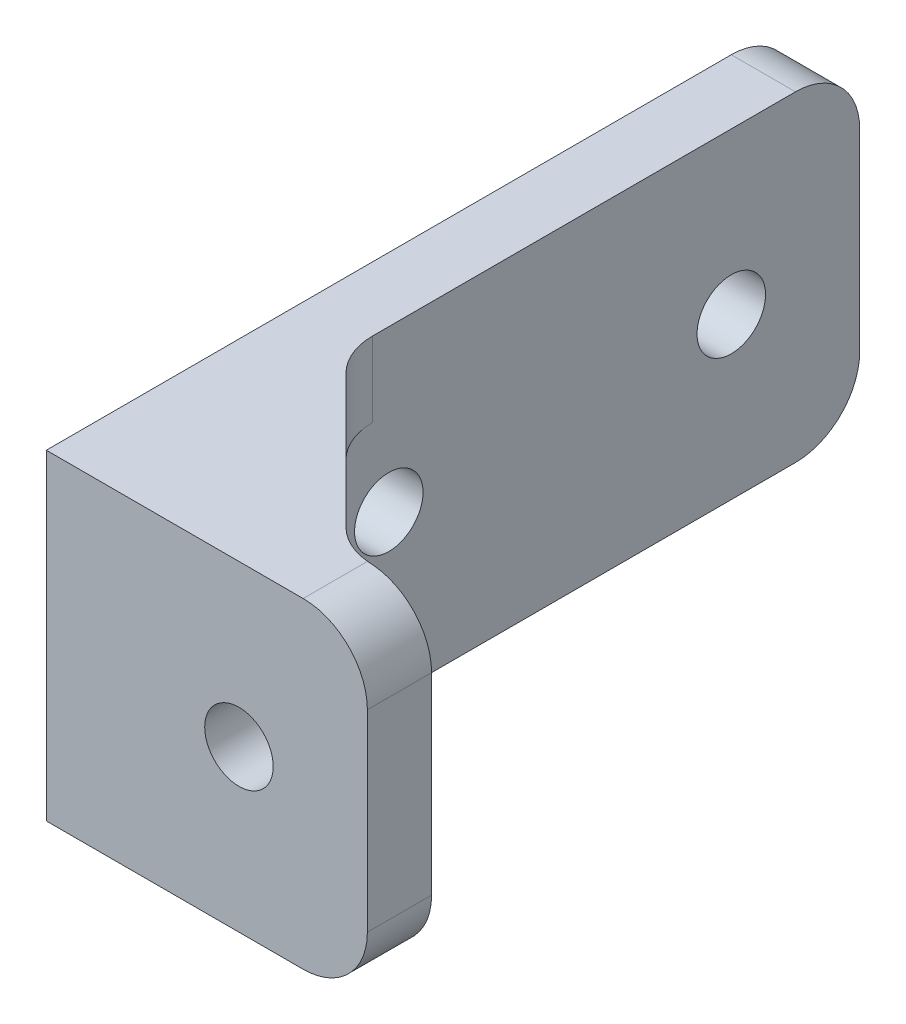
ISO-10303-21;
HEADER;
FILE_DESCRIPTION(('STEP AP214'),'2;1');
FILE_NAME('part.step','',(''),(''),'','','');
FILE_SCHEMA(('AUTOMOTIVE_DESIGN { 1 0 10303 214 1 1 1 1 }'));
ENDSEC;
DATA;
#1=APPLICATION_CONTEXT('core data for automotive mechanical design processes');
#2=APPLICATION_PROTOCOL_DEFINITION('international standard','automotive_design',2000,#1);
#3=PRODUCT_CONTEXT('',#1,'mechanical');
#4=PRODUCT('Part','Part','',(#3));
#5=PRODUCT_RELATED_PRODUCT_CATEGORY('part','',(#4));
#6=PRODUCT_DEFINITION_FORMATION('','',#4);
#7=PRODUCT_DEFINITION_CONTEXT('part definition',#1,'design');
#8=PRODUCT_DEFINITION('design','',#6,#7);
#9=PRODUCT_DEFINITION_SHAPE('','',#8);
#10=(LENGTH_UNIT() NAMED_UNIT(*) SI_UNIT(.MILLI.,.METRE.));
#11=(NAMED_UNIT(*) PLANE_ANGLE_UNIT() SI_UNIT($,.RADIAN.));
#12=(NAMED_UNIT(*) SI_UNIT($,.STERADIAN.) SOLID_ANGLE_UNIT());
#13=UNCERTAINTY_MEASURE_WITH_UNIT(LENGTH_MEASURE(1.E-05),#10,'distance_accuracy_value','');
#14=(GEOMETRIC_REPRESENTATION_CONTEXT(3) GLOBAL_UNCERTAINTY_ASSIGNED_CONTEXT((#13)) GLOBAL_UNIT_ASSIGNED_CONTEXT((#10,
#11,#12)) REPRESENTATION_CONTEXT('',''));
#15=CARTESIAN_POINT('',(0.,0.,0.));
#16=DIRECTION('',(0.,0.,1.));
#17=DIRECTION('',(1.,0.,0.));
#18=AXIS2_PLACEMENT_3D('',#15,#16,#17);
#19=CARTESIAN_POINT('',(3.,15.,-11.));
#20=DIRECTION('',(-0.707106781186551,0.,0.707106781186544));
#21=DIRECTION('',(0.,-1.,0.));
#22=AXIS2_PLACEMENT_3D('',#19,#20,#21);
#23=PLANE('',#22);
#24=DIRECTION('',(0.707106781186544,0.,0.707106781186551));
#25=VECTOR('',#24,1.);
#26=CARTESIAN_POINT('',(3.,3.5,-11.));
#27=LINE('',#26,#25);
#28=CARTESIAN_POINT('',(3.87867965644035,3.5,-10.1213203435597));
#29=VERTEX_POINT('',#28);
#30=CARTESIAN_POINT('',(10.1213203435596,3.5,-3.87867965644037));
#31=VERTEX_POINT('',#30);
#32=EDGE_CURVE('E297',#29,#31,#27,.T.);
#33=ORIENTED_EDGE('',*,*,#32,.T.);
#34=DIRECTION('',(0.,1.,0.));
#35=VECTOR('',#34,1.);
#36=CARTESIAN_POINT('',(10.1213203435596,15.,-3.87867965644037));
#37=LINE('',#36,#35);
#38=CARTESIAN_POINT('',(10.1213203435596,0.,-3.87867965644037));
#39=VERTEX_POINT('',#38);
#40=EDGE_CURVE('E333',#31,#39,#37,.F.);
#41=ORIENTED_EDGE('',*,*,#40,.T.);
#42=DIRECTION('',(0.707106781186544,0.,0.707106781186551));
#43=VECTOR('',#42,1.);
#44=CARTESIAN_POINT('',(7.00000000000004,0.,-6.99999999999997));
#45=LINE('',#44,#43);
#46=CARTESIAN_POINT('',(3.87867965644035,0.,-10.1213203435597));
#47=VERTEX_POINT('',#46);
#48=EDGE_CURVE('E285',#47,#39,#45,.T.);
#49=ORIENTED_EDGE('',*,*,#48,.F.);
#50=DIRECTION('',(0.,-1.,0.));
#51=VECTOR('',#50,1.);
#52=CARTESIAN_POINT('',(3.87867965644035,3.5,-10.1213203435597));
#53=LINE('',#52,#51);
#54=EDGE_CURVE('E330',#47,#29,#53,.F.);
#55=ORIENTED_EDGE('',*,*,#54,.T.);
#56=EDGE_LOOP('',(#33,#41,#49,#55));
#57=FACE_BOUND('',#56,.T.);
#58=ADVANCED_FACE('F47',(#57),#23,.F.);
#59=CARTESIAN_POINT('',(0.,15.,0.));
#60=DIRECTION('',(-1.,0.,0.));
#61=DIRECTION('',(0.,0.,1.));
#62=AXIS2_PLACEMENT_3D('',#59,#60,#61);
#63=PLANE('',#62);
#64=CARTESIAN_POINT('',(0.,7.5,-13.));
#65=DIRECTION('',(1.,0.,0.));
#66=DIRECTION('',(0.,0.,-1.));
#67=AXIS2_PLACEMENT_3D('',#64,#65,#66);
#68=CIRCLE('',#67,1.6);
#69=CARTESIAN_POINT('',(0.,7.5,-14.6));
#70=VERTEX_POINT('',#69);
#71=EDGE_CURVE('E493',#70,#70,#68,.T.);
#72=ORIENTED_EDGE('',*,*,#71,.T.);
#73=EDGE_LOOP('',(#72));
#74=FACE_BOUND('',#73,.T.);
#75=CARTESIAN_POINT('',(0.,7.5,-29.));
#76=DIRECTION('',(1.,0.,0.));
#77=DIRECTION('',(0.,0.,-1.));
#78=AXIS2_PLACEMENT_3D('',#75,#76,#77);
#79=CIRCLE('',#78,1.6);
#80=CARTESIAN_POINT('',(0.,7.5,-30.6));
#81=VERTEX_POINT('',#80);
#82=EDGE_CURVE('E492',#81,#81,#79,.T.);
#83=ORIENTED_EDGE('',*,*,#82,.T.);
#84=EDGE_LOOP('',(#83));
#85=FACE_BOUND('',#84,.T.);
#86=DIRECTION('',(0.,0.,-1.));
#87=VECTOR('',#86,1.);
#88=CARTESIAN_POINT('',(0.,15.,0.));
#89=LINE('',#88,#87);
#90=CARTESIAN_POINT('',(0.,15.,0.));
#91=VERTEX_POINT('',#90);
#92=CARTESIAN_POINT('',(0.,15.,-32.));
#93=VERTEX_POINT('',#92);
#94=EDGE_CURVE('E185',#91,#93,#89,.T.);
#95=ORIENTED_EDGE('',*,*,#94,.T.);
#96=CARTESIAN_POINT('',(0.,12.,-32.));
#97=DIRECTION('',(-1.,0.,0.));
#98=DIRECTION('',(0.,0.,1.));
#99=AXIS2_PLACEMENT_3D('',#96,#97,#98);
#100=CIRCLE('',#99,3.);
#101=CARTESIAN_POINT('',(0.,12.,-35.));
#102=VERTEX_POINT('',#101);
#103=EDGE_CURVE('E257',#93,#102,#100,.T.);
#104=ORIENTED_EDGE('',*,*,#103,.T.);
#105=DIRECTION('',(0.,-1.,0.));
#106=VECTOR('',#105,1.);
#107=CARTESIAN_POINT('',(0.,15.,-35.));
#108=LINE('',#107,#106);
#109=CARTESIAN_POINT('',(0.,3.,-35.));
#110=VERTEX_POINT('',#109);
#111=EDGE_CURVE('E219',#102,#110,#108,.T.);
#112=ORIENTED_EDGE('',*,*,#111,.T.);
#113=CARTESIAN_POINT('',(0.,3.,-32.));
#114=DIRECTION('',(-1.,0.,0.));
#115=DIRECTION('',(0.,0.,1.));
#116=AXIS2_PLACEMENT_3D('',#113,#114,#115);
#117=CIRCLE('',#116,3.);
#118=CARTESIAN_POINT('',(0.,0.,-32.));
#119=VERTEX_POINT('',#118);
#120=EDGE_CURVE('E254',#110,#119,#117,.T.);
#121=ORIENTED_EDGE('',*,*,#120,.T.);
#122=DIRECTION('',(0.,0.,-1.));
#123=VECTOR('',#122,1.);
#124=CARTESIAN_POINT('',(0.,0.,0.));
#125=LINE('',#124,#123);
#126=CARTESIAN_POINT('',(0.,0.,0.));
#127=VERTEX_POINT('',#126);
#128=EDGE_CURVE('E188',#127,#119,#125,.T.);
#129=ORIENTED_EDGE('',*,*,#128,.F.);
#130=DIRECTION('',(0.,-1.,0.));
#131=VECTOR('',#130,1.);
#132=CARTESIAN_POINT('',(0.,15.,0.));
#133=LINE('',#132,#131);
#134=EDGE_CURVE('E181',#91,#127,#133,.T.);
#135=ORIENTED_EDGE('',*,*,#134,.F.);
#136=EDGE_LOOP('',(#95,#104,#112,#121,#129,#135));
#137=FACE_BOUND('',#136,.T.);
#138=ADVANCED_FACE('F183',(#74,#85,#137),#63,.T.);
#139=CARTESIAN_POINT('',(0.,15.,0.));
#140=DIRECTION('',(0.,0.,-1.));
#141=DIRECTION('',(-1.,0.,0.));
#142=AXIS2_PLACEMENT_3D('',#139,#140,#141);
#143=PLANE('',#142);
#144=CARTESIAN_POINT('',(9.,7.5,0.));
#145=DIRECTION('',(0.,0.,-1.));
#146=DIRECTION('',(-1.,0.,0.));
#147=AXIS2_PLACEMENT_3D('',#144,#145,#146);
#148=CIRCLE('',#147,1.6);
#149=CARTESIAN_POINT('',(7.4,7.5,0.));
#150=VERTEX_POINT('',#149);
#151=EDGE_CURVE('E214',#150,#150,#148,.T.);
#152=ORIENTED_EDGE('',*,*,#151,.T.);
#153=EDGE_LOOP('',(#152));
#154=FACE_BOUND('',#153,.T.);
#155=DIRECTION('',(0.,-1.,0.));
#156=VECTOR('',#155,1.);
#157=CARTESIAN_POINT('',(15.,15.,0.));
#158=LINE('',#157,#156);
#159=CARTESIAN_POINT('',(15.,12.,0.));
#160=VERTEX_POINT('',#159);
#161=CARTESIAN_POINT('',(15.,3.,0.));
#162=VERTEX_POINT('',#161);
#163=EDGE_CURVE('E194',#160,#162,#158,.T.);
#164=ORIENTED_EDGE('',*,*,#163,.F.);
#165=CARTESIAN_POINT('',(12.,12.,0.));
#166=DIRECTION('',(0.,0.,-1.));
#167=DIRECTION('',(-1.,0.,0.));
#168=AXIS2_PLACEMENT_3D('',#165,#166,#167);
#169=CIRCLE('',#168,3.);
#170=CARTESIAN_POINT('',(12.,15.,0.));
#171=VERTEX_POINT('',#170);
#172=EDGE_CURVE('E200',#160,#171,#169,.F.);
#173=ORIENTED_EDGE('',*,*,#172,.T.);
#174=DIRECTION('',(1.,0.,0.));
#175=VECTOR('',#174,1.);
#176=CARTESIAN_POINT('',(0.,15.,0.));
#177=LINE('',#176,#175);
#178=EDGE_CURVE('E196',#91,#171,#177,.T.);
#179=ORIENTED_EDGE('',*,*,#178,.F.);
#180=ORIENTED_EDGE('',*,*,#134,.T.);
#181=DIRECTION('',(1.,0.,0.));
#182=VECTOR('',#181,1.);
#183=CARTESIAN_POINT('',(0.,0.,0.));
#184=LINE('',#183,#182);
#185=CARTESIAN_POINT('',(12.,0.,0.));
#186=VERTEX_POINT('',#185);
#187=EDGE_CURVE('E211',#127,#186,#184,.T.);
#188=ORIENTED_EDGE('',*,*,#187,.T.);
#189=CARTESIAN_POINT('',(12.,3.,0.));
#190=DIRECTION('',(0.,0.,-1.));
#191=DIRECTION('',(-1.,0.,0.));
#192=AXIS2_PLACEMENT_3D('',#189,#190,#191);
#193=CIRCLE('',#192,3.);
#194=EDGE_CURVE('E280',#186,#162,#193,.F.);
#195=ORIENTED_EDGE('',*,*,#194,.T.);
#196=EDGE_LOOP('',(#164,#173,#179,#180,#188,#195));
#197=FACE_BOUND('',#196,.T.);
#198=ADVANCED_FACE('F198',(#154,#197),#143,.F.);
#199=CARTESIAN_POINT('',(15.,15.,0.));
#200=DIRECTION('',(-1.,0.,0.));
#201=DIRECTION('',(0.,0.,1.));
#202=AXIS2_PLACEMENT_3D('',#199,#200,#201);
#203=PLANE('',#202);
#204=DIRECTION('',(0.,-1.,0.));
#205=VECTOR('',#204,1.);
#206=CARTESIAN_POINT('',(15.,15.,-3.));
#207=LINE('',#206,#205);
#208=CARTESIAN_POINT('',(15.,12.,-3.));
#209=VERTEX_POINT('',#208);
#210=CARTESIAN_POINT('',(15.,3.,-3.));
#211=VERTEX_POINT('',#210);
#212=EDGE_CURVE('E231',#209,#211,#207,.T.);
#213=ORIENTED_EDGE('',*,*,#212,.F.);
#214=DIRECTION('',(0.,0.,-1.));
#215=VECTOR('',#214,1.);
#216=CARTESIAN_POINT('',(15.,12.,0.));
#217=LINE('',#216,#215);
#218=EDGE_CURVE('E277',#209,#160,#217,.F.);
#219=ORIENTED_EDGE('',*,*,#218,.T.);
#220=ORIENTED_EDGE('',*,*,#163,.T.);
#221=DIRECTION('',(0.,0.,-1.));
#222=VECTOR('',#221,1.);
#223=CARTESIAN_POINT('',(15.,3.,0.));
#224=LINE('',#223,#222);
#225=EDGE_CURVE('E273',#162,#211,#224,.T.);
#226=ORIENTED_EDGE('',*,*,#225,.T.);
#227=EDGE_LOOP('',(#213,#219,#220,#226));
#228=FACE_BOUND('',#227,.T.);
#229=ADVANCED_FACE('F468',(#228),#203,.F.);
#230=CARTESIAN_POINT('',(0.,15.,-3.));
#231=DIRECTION('',(0.,0.,-1.));
#232=DIRECTION('',(-1.,0.,0.));
#233=AXIS2_PLACEMENT_3D('',#230,#231,#232);
#234=PLANE('',#233);
#235=DIRECTION('',(1.,0.,0.));
#236=VECTOR('',#235,1.);
#237=CARTESIAN_POINT('',(-8.31370849898479,3.5,-3.));
#238=LINE('',#237,#236);
#239=CARTESIAN_POINT('',(6.,3.5,-3.));
#240=VERTEX_POINT('',#239);
#241=CARTESIAN_POINT('',(12.2426406871193,3.5,-3.));
#242=VERTEX_POINT('',#241);
#243=EDGE_CURVE('E478',#240,#242,#238,.T.);
#244=ORIENTED_EDGE('',*,*,#243,.F.);
#245=DIRECTION('',(0.,-1.,0.));
#246=VECTOR('',#245,1.);
#247=CARTESIAN_POINT('',(6.,15.,-3.));
#248=LINE('',#247,#246);
#249=CARTESIAN_POINT('',(6.,11.5,-3.));
#250=VERTEX_POINT('',#249);
#251=EDGE_CURVE('E324',#240,#250,#248,.F.);
#252=ORIENTED_EDGE('',*,*,#251,.T.);
#253=DIRECTION('',(1.,0.,0.));
#254=VECTOR('',#253,1.);
#255=CARTESIAN_POINT('',(-8.31370849898479,11.5,-3.));
#256=LINE('',#255,#254);
#257=CARTESIAN_POINT('',(12.2426406871193,11.5,-3.));
#258=VERTEX_POINT('',#257);
#259=EDGE_CURVE('E442',#250,#258,#256,.T.);
#260=ORIENTED_EDGE('',*,*,#259,.T.);
#261=DIRECTION('',(0.,1.,0.));
#262=VECTOR('',#261,1.);
#263=CARTESIAN_POINT('',(12.2426406871193,15.,-3.));
#264=LINE('',#263,#262);
#265=CARTESIAN_POINT('',(12.2426406871193,14.9901714828675,-3.));
#266=VERTEX_POINT('',#265);
#267=EDGE_CURVE('E316',#258,#266,#264,.T.);
#268=ORIENTED_EDGE('',*,*,#267,.T.);
#269=CARTESIAN_POINT('',(12.,12.,-3.));
#270=DIRECTION('',(0.,0.,-1.));
#271=DIRECTION('',(-1.,0.,0.));
#272=AXIS2_PLACEMENT_3D('',#269,#270,#271);
#273=CIRCLE('',#272,3.);
#274=EDGE_CURVE('E270',#266,#209,#273,.T.);
#275=ORIENTED_EDGE('',*,*,#274,.T.);
#276=ORIENTED_EDGE('',*,*,#212,.T.);
#277=CARTESIAN_POINT('',(12.,3.,-3.));
#278=DIRECTION('',(0.,0.,-1.));
#279=DIRECTION('',(-1.,0.,0.));
#280=AXIS2_PLACEMENT_3D('',#277,#278,#279);
#281=CIRCLE('',#280,3.);
#282=CARTESIAN_POINT('',(12.2426406871193,0.00982851713245353,-3.));
#283=VERTEX_POINT('',#282);
#284=EDGE_CURVE('E266',#211,#283,#281,.T.);
#285=ORIENTED_EDGE('',*,*,#284,.T.);
#286=DIRECTION('',(0.,1.,0.));
#287=VECTOR('',#286,1.);
#288=CARTESIAN_POINT('',(12.2426406871193,15.,-3.));
#289=LINE('',#288,#287);
#290=EDGE_CURVE('E320',#283,#242,#289,.T.);
#291=ORIENTED_EDGE('',*,*,#290,.T.);
#292=EDGE_LOOP('',(#244,#252,#260,#268,#275,#276,#285,#291));
#293=FACE_BOUND('',#292,.T.);
#294=CARTESIAN_POINT('',(9.,7.5,-3.));
#295=DIRECTION('',(0.,0.,1.));
#296=DIRECTION('',(0.,-1.,0.));
#297=AXIS2_PLACEMENT_3D('',#294,#295,#296);
#298=CIRCLE('',#297,1.6);
#299=CARTESIAN_POINT('',(9.,5.9,-3.));
#300=VERTEX_POINT('',#299);
#301=EDGE_CURVE('E483',#300,#300,#298,.F.);
#302=ORIENTED_EDGE('',*,*,#301,.F.);
#303=EDGE_LOOP('',(#302));
#304=FACE_BOUND('',#303,.T.);
#305=ADVANCED_FACE('F474',(#293,#304),#234,.T.);
#306=CARTESIAN_POINT('',(3.,15.,0.));
#307=DIRECTION('',(-1.,0.,0.));
#308=DIRECTION('',(0.,0.,1.));
#309=AXIS2_PLACEMENT_3D('',#306,#307,#308);
#310=PLANE('',#309);
#311=CARTESIAN_POINT('',(3.,7.5,-13.));
#312=DIRECTION('',(1.,0.,0.));
#313=DIRECTION('',(0.,0.,-1.));
#314=AXIS2_PLACEMENT_3D('',#311,#312,#313);
#315=CIRCLE('',#314,1.6);
#316=CARTESIAN_POINT('',(3.,7.5,-14.6));
#317=VERTEX_POINT('',#316);
#318=EDGE_CURVE('E497',#317,#317,#315,.T.);
#319=ORIENTED_EDGE('',*,*,#318,.F.);
#320=EDGE_LOOP('',(#319));
#321=FACE_BOUND('',#320,.T.);
#322=CARTESIAN_POINT('',(3.,7.5,-29.));
#323=DIRECTION('',(1.,0.,0.));
#324=DIRECTION('',(0.,0.,-1.));
#325=AXIS2_PLACEMENT_3D('',#322,#323,#324);
#326=CIRCLE('',#325,1.6);
#327=CARTESIAN_POINT('',(3.,7.5,-30.6));
#328=VERTEX_POINT('',#327);
#329=EDGE_CURVE('E501',#328,#328,#326,.T.);
#330=ORIENTED_EDGE('',*,*,#329,.F.);
#331=EDGE_LOOP('',(#330));
#332=FACE_BOUND('',#331,.T.);
#333=DIRECTION('',(0.,0.,1.));
#334=VECTOR('',#333,1.);
#335=CARTESIAN_POINT('',(3.,11.5,-3.));
#336=LINE('',#335,#334);
#337=CARTESIAN_POINT('',(3.,11.5,-12.2426406871193));
#338=VERTEX_POINT('',#337);
#339=CARTESIAN_POINT('',(3.,11.5,-6.));
#340=VERTEX_POINT('',#339);
#341=EDGE_CURVE('E479',#338,#340,#336,.T.);
#342=ORIENTED_EDGE('',*,*,#341,.T.);
#343=DIRECTION('',(0.,-1.,0.));
#344=VECTOR('',#343,1.);
#345=CARTESIAN_POINT('',(3.,15.,-6.));
#346=LINE('',#345,#344);
#347=CARTESIAN_POINT('',(3.,3.5,-6.));
#348=VERTEX_POINT('',#347);
#349=EDGE_CURVE('E309',#340,#348,#346,.T.);
#350=ORIENTED_EDGE('',*,*,#349,.T.);
#351=DIRECTION('',(0.,0.,-1.));
#352=VECTOR('',#351,1.);
#353=CARTESIAN_POINT('',(3.,3.5,-3.));
#354=LINE('',#353,#352);
#355=CARTESIAN_POINT('',(3.,3.5,-12.2426406871193));
#356=VERTEX_POINT('',#355);
#357=EDGE_CURVE('E485',#348,#356,#354,.T.);
#358=ORIENTED_EDGE('',*,*,#357,.T.);
#359=DIRECTION('',(0.,-1.,0.));
#360=VECTOR('',#359,1.);
#361=CARTESIAN_POINT('',(3.,0.,-12.2426406871193));
#362=LINE('',#361,#360);
#363=CARTESIAN_POINT('',(3.,0.,-12.2426406871193));
#364=VERTEX_POINT('',#363);
#365=EDGE_CURVE('E305',#356,#364,#362,.T.);
#366=ORIENTED_EDGE('',*,*,#365,.T.);
#367=DIRECTION('',(0.,0.,-1.));
#368=VECTOR('',#367,1.);
#369=CARTESIAN_POINT('',(3.,0.,0.));
#370=LINE('',#369,#368);
#371=CARTESIAN_POINT('',(3.,0.,-32.));
#372=VERTEX_POINT('',#371);
#373=EDGE_CURVE('E208',#364,#372,#370,.T.);
#374=ORIENTED_EDGE('',*,*,#373,.T.);
#375=CARTESIAN_POINT('',(3.,3.,-32.));
#376=DIRECTION('',(-1.,0.,0.));
#377=DIRECTION('',(0.,0.,1.));
#378=AXIS2_PLACEMENT_3D('',#375,#376,#377);
#379=CIRCLE('',#378,3.);
#380=CARTESIAN_POINT('',(3.,3.,-35.));
#381=VERTEX_POINT('',#380);
#382=EDGE_CURVE('E243',#372,#381,#379,.F.);
#383=ORIENTED_EDGE('',*,*,#382,.T.);
#384=DIRECTION('',(0.,-1.,0.));
#385=VECTOR('',#384,1.);
#386=CARTESIAN_POINT('',(3.,15.,-35.));
#387=LINE('',#386,#385);
#388=CARTESIAN_POINT('',(3.,12.,-35.));
#389=VERTEX_POINT('',#388);
#390=EDGE_CURVE('E227',#389,#381,#387,.T.);
#391=ORIENTED_EDGE('',*,*,#390,.F.);
#392=CARTESIAN_POINT('',(3.,12.,-32.));
#393=DIRECTION('',(-1.,0.,0.));
#394=DIRECTION('',(0.,0.,1.));
#395=AXIS2_PLACEMENT_3D('',#392,#393,#394);
#396=CIRCLE('',#395,3.);
#397=CARTESIAN_POINT('',(3.,15.,-32.));
#398=VERTEX_POINT('',#397);
#399=EDGE_CURVE('E246',#389,#398,#396,.F.);
#400=ORIENTED_EDGE('',*,*,#399,.T.);
#401=DIRECTION('',(0.,0.,-1.));
#402=VECTOR('',#401,1.);
#403=CARTESIAN_POINT('',(3.,15.,0.));
#404=LINE('',#403,#402);
#405=CARTESIAN_POINT('',(3.,15.,-12.2426406871193));
#406=VERTEX_POINT('',#405);
#407=EDGE_CURVE('E202',#406,#398,#404,.T.);
#408=ORIENTED_EDGE('',*,*,#407,.F.);
#409=DIRECTION('',(0.,-1.,0.));
#410=VECTOR('',#409,1.);
#411=CARTESIAN_POINT('',(3.,11.5,-12.2426406871193));
#412=LINE('',#411,#410);
#413=EDGE_CURVE('E301',#406,#338,#412,.T.);
#414=ORIENTED_EDGE('',*,*,#413,.T.);
#415=EDGE_LOOP('',(#342,#350,#358,#366,#374,#383,#391,#400,#408,#414));
#416=FACE_BOUND('',#415,.T.);
#417=ADVANCED_FACE('F450',(#321,#332,#416),#310,.F.);
#418=CARTESIAN_POINT('',(0.,15.,-35.));
#419=DIRECTION('',(0.,0.,-1.));
#420=DIRECTION('',(-1.,0.,0.));
#421=AXIS2_PLACEMENT_3D('',#418,#419,#420);
#422=PLANE('',#421);
#423=ORIENTED_EDGE('',*,*,#111,.F.);
#424=DIRECTION('',(1.,0.,0.));
#425=VECTOR('',#424,1.);
#426=CARTESIAN_POINT('',(0.,12.,-35.));
#427=LINE('',#426,#425);
#428=EDGE_CURVE('E239',#102,#389,#427,.T.);
#429=ORIENTED_EDGE('',*,*,#428,.T.);
#430=ORIENTED_EDGE('',*,*,#390,.T.);
#431=DIRECTION('',(1.,0.,0.));
#432=VECTOR('',#431,1.);
#433=CARTESIAN_POINT('',(0.,3.,-35.));
#434=LINE('',#433,#432);
#435=EDGE_CURVE('E193',#381,#110,#434,.F.);
#436=ORIENTED_EDGE('',*,*,#435,.T.);
#437=EDGE_LOOP('',(#423,#429,#430,#436));
#438=FACE_BOUND('',#437,.T.);
#439=ADVANCED_FACE('F458',(#438),#422,.T.);
#440=CARTESIAN_POINT('',(0.,15.,0.));
#441=DIRECTION('',(0.,1.,0.));
#442=DIRECTION('',(0.,0.,1.));
#443=AXIS2_PLACEMENT_3D('',#440,#441,#442);
#444=PLANE('',#443);
#445=DIRECTION('',(0.,0.,-1.));
#446=VECTOR('',#445,1.);
#447=CARTESIAN_POINT('',(12.,15.,-3.));
#448=LINE('',#447,#446);
#449=CARTESIAN_POINT('',(12.,15.,-3.00982851713245));
#450=VERTEX_POINT('',#449);
#451=EDGE_CURVE('E64',#171,#450,#448,.T.);
#452=ORIENTED_EDGE('',*,*,#451,.T.);
#453=CARTESIAN_POINT('',(12.2426406871193,15.,-6.));
#454=DIRECTION('',(0.,1.,0.));
#455=DIRECTION('',(0.,0.,1.));
#456=AXIS2_PLACEMENT_3D('',#453,#454,#455);
#457=CIRCLE('',#456,3.);
#458=CARTESIAN_POINT('',(10.1213203435596,15.,-3.87867965644037));
#459=VERTEX_POINT('',#458);
#460=EDGE_CURVE('E57',#450,#459,#457,.F.);
#461=ORIENTED_EDGE('',*,*,#460,.T.);
#462=DIRECTION('',(-0.707106781186544,0.,-0.707106781186551));
#463=VECTOR('',#462,1.);
#464=CARTESIAN_POINT('',(3.,15.,-11.));
#465=LINE('',#464,#463);
#466=CARTESIAN_POINT('',(3.87867965644035,15.,-10.1213203435597));
#467=VERTEX_POINT('',#466);
#468=EDGE_CURVE('E289',#459,#467,#465,.T.);
#469=ORIENTED_EDGE('',*,*,#468,.T.);
#470=CARTESIAN_POINT('',(6.,15.,-12.2426406871193));
#471=DIRECTION('',(0.,1.,0.));
#472=DIRECTION('',(0.,0.,1.));
#473=AXIS2_PLACEMENT_3D('',#470,#471,#472);
#474=CIRCLE('',#473,3.);
#475=EDGE_CURVE('E420',#467,#406,#474,.F.);
#476=ORIENTED_EDGE('',*,*,#475,.T.);
#477=ORIENTED_EDGE('',*,*,#407,.T.);
#478=DIRECTION('',(1.,0.,0.));
#479=VECTOR('',#478,1.);
#480=CARTESIAN_POINT('',(0.,15.,-32.));
#481=LINE('',#480,#479);
#482=EDGE_CURVE('E206',#398,#93,#481,.F.);
#483=ORIENTED_EDGE('',*,*,#482,.T.);
#484=ORIENTED_EDGE('',*,*,#94,.F.);
#485=ORIENTED_EDGE('',*,*,#178,.T.);
#486=EDGE_LOOP('',(#452,#461,#469,#476,#477,#483,#484,#485));
#487=FACE_BOUND('',#486,.T.);
#488=ADVANCED_FACE('F204',(#487),#444,.T.);
#489=CARTESIAN_POINT('',(0.,0.,0.));
#490=DIRECTION('',(0.,1.,0.));
#491=DIRECTION('',(0.,0.,1.));
#492=AXIS2_PLACEMENT_3D('',#489,#490,#491);
#493=PLANE('',#492);
#494=ORIENTED_EDGE('',*,*,#128,.T.);
#495=DIRECTION('',(1.,0.,0.));
#496=VECTOR('',#495,1.);
#497=CARTESIAN_POINT('',(3.,0.,-32.));
#498=LINE('',#497,#496);
#499=EDGE_CURVE('E262',#119,#372,#498,.T.);
#500=ORIENTED_EDGE('',*,*,#499,.T.);
#501=ORIENTED_EDGE('',*,*,#373,.F.);
#502=CARTESIAN_POINT('',(6.,0.,-12.2426406871193));
#503=DIRECTION('',(0.,1.,0.));
#504=DIRECTION('',(0.,0.,1.));
#505=AXIS2_PLACEMENT_3D('',#502,#503,#504);
#506=CIRCLE('',#505,3.);
#507=EDGE_CURVE('E357',#364,#47,#506,.T.);
#508=ORIENTED_EDGE('',*,*,#507,.T.);
#509=ORIENTED_EDGE('',*,*,#48,.T.);
#510=CARTESIAN_POINT('',(12.2426406871193,0.,-6.));
#511=DIRECTION('',(0.,1.,0.));
#512=DIRECTION('',(0.,0.,1.));
#513=AXIS2_PLACEMENT_3D('',#510,#511,#512);
#514=CIRCLE('',#513,3.);
#515=CARTESIAN_POINT('',(12.,0.,-3.00982851713245));
#516=VERTEX_POINT('',#515);
#517=EDGE_CURVE('E345',#39,#516,#514,.T.);
#518=ORIENTED_EDGE('',*,*,#517,.T.);
#519=DIRECTION('',(0.,0.,-1.));
#520=VECTOR('',#519,1.);
#521=CARTESIAN_POINT('',(12.,0.,0.));
#522=LINE('',#521,#520);
#523=EDGE_CURVE('E72',#516,#186,#522,.F.);
#524=ORIENTED_EDGE('',*,*,#523,.T.);
#525=ORIENTED_EDGE('',*,*,#187,.F.);
#526=EDGE_LOOP('',(#494,#500,#501,#508,#509,#518,#524,#525));
#527=FACE_BOUND('',#526,.T.);
#528=ADVANCED_FACE('F410',(#527),#493,.F.);
#529=CARTESIAN_POINT('',(9.,7.5,0.));
#530=DIRECTION('',(0.,0.,-1.));
#531=DIRECTION('',(-1.,0.,0.));
#532=AXIS2_PLACEMENT_3D('',#529,#530,#531);
#533=CYLINDRICAL_SURFACE('',#532,1.6);
#534=ORIENTED_EDGE('',*,*,#301,.T.);
#535=EDGE_LOOP('',(#534));
#536=FACE_BOUND('',#535,.T.);
#537=ORIENTED_EDGE('',*,*,#151,.F.);
#538=EDGE_LOOP('',(#537));
#539=FACE_BOUND('',#538,.T.);
#540=ADVANCED_FACE('F513',(#536,#539),#533,.F.);
#541=CARTESIAN_POINT('',(0.,7.5,-29.));
#542=DIRECTION('',(1.,0.,0.));
#543=DIRECTION('',(0.,0.,-1.));
#544=AXIS2_PLACEMENT_3D('',#541,#542,#543);
#545=CYLINDRICAL_SURFACE('',#544,1.6);
#546=ORIENTED_EDGE('',*,*,#82,.F.);
#547=EDGE_LOOP('',(#546));
#548=FACE_BOUND('',#547,.T.);
#549=ORIENTED_EDGE('',*,*,#329,.T.);
#550=EDGE_LOOP('',(#549));
#551=FACE_BOUND('',#550,.T.);
#552=ADVANCED_FACE('F509',(#548,#551),#545,.F.);
#553=CARTESIAN_POINT('',(0.,7.5,-13.));
#554=DIRECTION('',(1.,0.,0.));
#555=DIRECTION('',(0.,0.,-1.));
#556=AXIS2_PLACEMENT_3D('',#553,#554,#555);
#557=CYLINDRICAL_SURFACE('',#556,1.6);
#558=ORIENTED_EDGE('',*,*,#71,.F.);
#559=EDGE_LOOP('',(#558));
#560=FACE_BOUND('',#559,.T.);
#561=ORIENTED_EDGE('',*,*,#318,.T.);
#562=EDGE_LOOP('',(#561));
#563=FACE_BOUND('',#562,.T.);
#564=ADVANCED_FACE('F512',(#560,#563),#557,.F.);
#565=CARTESIAN_POINT('',(0.,12.,-32.));
#566=DIRECTION('',(1.,0.,0.));
#567=DIRECTION('',(0.,0.,-1.));
#568=AXIS2_PLACEMENT_3D('',#565,#566,#567);
#569=CYLINDRICAL_SURFACE('',#568,3.);
#570=ORIENTED_EDGE('',*,*,#103,.F.);
#571=ORIENTED_EDGE('',*,*,#482,.F.);
#572=ORIENTED_EDGE('',*,*,#399,.F.);
#573=ORIENTED_EDGE('',*,*,#428,.F.);
#574=EDGE_LOOP('',(#570,#571,#572,#573));
#575=FACE_BOUND('',#574,.T.);
#576=ADVANCED_FACE('F454',(#575),#569,.T.);
#577=CARTESIAN_POINT('',(0.,3.,-32.));
#578=DIRECTION('',(-1.,0.,0.));
#579=DIRECTION('',(0.,0.,1.));
#580=AXIS2_PLACEMENT_3D('',#577,#578,#579);
#581=CYLINDRICAL_SURFACE('',#580,3.);
#582=ORIENTED_EDGE('',*,*,#120,.F.);
#583=ORIENTED_EDGE('',*,*,#435,.F.);
#584=ORIENTED_EDGE('',*,*,#382,.F.);
#585=ORIENTED_EDGE('',*,*,#499,.F.);
#586=EDGE_LOOP('',(#582,#583,#584,#585));
#587=FACE_BOUND('',#586,.T.);
#588=ADVANCED_FACE('F462',(#587),#581,.T.);
#589=CARTESIAN_POINT('',(12.,12.,0.));
#590=DIRECTION('',(0.,0.,1.));
#591=DIRECTION('',(1.,0.,0.));
#592=AXIS2_PLACEMENT_3D('',#589,#590,#591);
#593=CYLINDRICAL_SURFACE('',#592,3.);
#594=ORIENTED_EDGE('',*,*,#172,.F.);
#595=ORIENTED_EDGE('',*,*,#218,.F.);
#596=ORIENTED_EDGE('',*,*,#274,.F.);
#597=CARTESIAN_POINT('',(12.2426406871193,14.9901714828675,-3.));
#598=CARTESIAN_POINT('',(12.2022005725994,14.9934496693885,-2.99999798585657));
#599=CARTESIAN_POINT('',(12.1617604580795,14.9959078057433,-3.00081602187923));
#600=CARTESIAN_POINT('',(12.0808802290398,14.9991839781208,-3.00409219425671));
#601=CARTESIAN_POINT('',(12.0404401145199,15.0000020141434,-3.00655033061154));
#602=CARTESIAN_POINT('',(12.,15.,-3.00982851713245));
#603=B_SPLINE_CURVE_WITH_KNOTS('',3,(#597,#598,#599,#600,#601,#602),.UNSPECIFIED.,.F.,.F.,(4,2,
4),(0.,0.121569035189417,0.243138070378835),.UNSPECIFIED.);
#604=EDGE_CURVE('E425',#266,#450,#603,.T.);
#605=ORIENTED_EDGE('',*,*,#604,.T.);
#606=ORIENTED_EDGE('',*,*,#451,.F.);
#607=EDGE_LOOP('',(#594,#595,#596,#605,#606));
#608=FACE_BOUND('',#607,.T.);
#609=ADVANCED_FACE('F369',(#608),#593,.T.);
#610=CARTESIAN_POINT('',(12.,3.,0.));
#611=DIRECTION('',(0.,0.,-1.));
#612=DIRECTION('',(-1.,0.,0.));
#613=AXIS2_PLACEMENT_3D('',#610,#611,#612);
#614=CYLINDRICAL_SURFACE('',#613,3.);
#615=ORIENTED_EDGE('',*,*,#194,.F.);
#616=ORIENTED_EDGE('',*,*,#523,.F.);
#617=CARTESIAN_POINT('',(12.,0.,-3.00982851713245));
#618=CARTESIAN_POINT('',(12.0404401145199,-2.01414342796575E-06,-3.00655033061154));
#619=CARTESIAN_POINT('',(12.0808802290398,0.000816021879229198,-3.00409219425671));
#620=CARTESIAN_POINT('',(12.1617604580795,0.00409219425671379,-3.00081602187923));
#621=CARTESIAN_POINT('',(12.2022005725994,0.00655033061154121,-2.99999798585657));
#622=CARTESIAN_POINT('',(12.2426406871193,0.00982851713245376,-3.));
#623=B_SPLINE_CURVE_WITH_KNOTS('',3,(#617,#618,#619,#620,#621,#622),.UNSPECIFIED.,.F.,.F.,(4,2,
4),(0.,0.121569035189417,0.243138070378835),.UNSPECIFIED.);
#624=EDGE_CURVE('E348',#516,#283,#623,.T.);
#625=ORIENTED_EDGE('',*,*,#624,.T.);
#626=ORIENTED_EDGE('',*,*,#284,.F.);
#627=ORIENTED_EDGE('',*,*,#225,.F.);
#628=EDGE_LOOP('',(#615,#616,#625,#626,#627));
#629=FACE_BOUND('',#628,.T.);
#630=ADVANCED_FACE('F363',(#629),#614,.T.);
#631=DIRECTION('',(-0.707106781186544,0.,-0.707106781186551));
#632=VECTOR('',#631,1.);
#633=CARTESIAN_POINT('',(3.,11.5,-11.));
#634=LINE('',#633,#632);
#635=CARTESIAN_POINT('',(10.1213203435596,11.5,-3.87867965644037));
#636=VERTEX_POINT('',#635);
#637=CARTESIAN_POINT('',(3.87867965644035,11.5,-10.1213203435597));
#638=VERTEX_POINT('',#637);
#639=EDGE_CURVE('E293',#636,#638,#634,.T.);
#640=ORIENTED_EDGE('',*,*,#639,.T.);
#641=DIRECTION('',(0.,-1.,0.));
#642=VECTOR('',#641,1.);
#643=CARTESIAN_POINT('',(3.87867965644035,15.,-10.1213203435597));
#644=LINE('',#643,#642);
#645=EDGE_CURVE('E339',#638,#467,#644,.F.);
#646=ORIENTED_EDGE('',*,*,#645,.T.);
#647=ORIENTED_EDGE('',*,*,#468,.F.);
#648=DIRECTION('',(0.,1.,0.));
#649=VECTOR('',#648,1.);
#650=CARTESIAN_POINT('',(10.1213203435596,15.,-3.87867965644037));
#651=LINE('',#650,#649);
#652=EDGE_CURVE('E336',#459,#636,#651,.F.);
#653=ORIENTED_EDGE('',*,*,#652,.T.);
#654=EDGE_LOOP('',(#640,#646,#647,#653));
#655=FACE_BOUND('',#654,.T.);
#656=ADVANCED_FACE('F368',(#655),#23,.F.);
#657=CARTESIAN_POINT('',(-8.31370849898479,3.5,-3.));
#658=DIRECTION('',(0.,-1.,0.));
#659=DIRECTION('',(0.,0.,-1.));
#660=AXIS2_PLACEMENT_3D('',#657,#658,#659);
#661=PLANE('',#660);
#662=ORIENTED_EDGE('',*,*,#357,.F.);
#663=CARTESIAN_POINT('',(6.,3.5,-6.));
#664=DIRECTION('',(0.,-1.,0.));
#665=DIRECTION('',(0.,0.,-1.));
#666=AXIS2_PLACEMENT_3D('',#663,#664,#665);
#667=CIRCLE('',#666,3.);
#668=EDGE_CURVE('E313',#348,#240,#667,.F.);
#669=ORIENTED_EDGE('',*,*,#668,.T.);
#670=ORIENTED_EDGE('',*,*,#243,.T.);
#671=CARTESIAN_POINT('',(12.2426406871193,3.5,-6.));
#672=DIRECTION('',(0.,-1.,0.));
#673=DIRECTION('',(0.,0.,-1.));
#674=AXIS2_PLACEMENT_3D('',#671,#672,#673);
#675=CIRCLE('',#674,3.);
#676=EDGE_CURVE('E342',#242,#31,#675,.T.);
#677=ORIENTED_EDGE('',*,*,#676,.T.);
#678=ORIENTED_EDGE('',*,*,#32,.F.);
#679=CARTESIAN_POINT('',(6.,3.5,-12.2426406871193));
#680=DIRECTION('',(0.,-1.,0.));
#681=DIRECTION('',(0.,0.,-1.));
#682=AXIS2_PLACEMENT_3D('',#679,#680,#681);
#683=CIRCLE('',#682,3.);
#684=EDGE_CURVE('E414',#29,#356,#683,.T.);
#685=ORIENTED_EDGE('',*,*,#684,.T.);
#686=EDGE_LOOP('',(#662,#669,#670,#677,#678,#685));
#687=FACE_BOUND('',#686,.T.);
#688=ADVANCED_FACE('F376',(#687),#661,.F.);
#689=CARTESIAN_POINT('',(-8.31370849898479,11.5,-3.));
#690=DIRECTION('',(0.,1.,0.));
#691=DIRECTION('',(0.,0.,1.));
#692=AXIS2_PLACEMENT_3D('',#689,#690,#691);
#693=PLANE('',#692);
#694=ORIENTED_EDGE('',*,*,#259,.F.);
#695=CARTESIAN_POINT('',(6.,11.5,-6.));
#696=DIRECTION('',(0.,1.,0.));
#697=DIRECTION('',(0.,0.,1.));
#698=AXIS2_PLACEMENT_3D('',#695,#696,#697);
#699=CIRCLE('',#698,3.);
#700=EDGE_CURVE('E327',#250,#340,#699,.F.);
#701=ORIENTED_EDGE('',*,*,#700,.T.);
#702=ORIENTED_EDGE('',*,*,#341,.F.);
#703=CARTESIAN_POINT('',(6.,11.5,-12.2426406871193));
#704=DIRECTION('',(0.,1.,0.));
#705=DIRECTION('',(0.,0.,1.));
#706=AXIS2_PLACEMENT_3D('',#703,#704,#705);
#707=CIRCLE('',#706,3.);
#708=EDGE_CURVE('E417',#338,#638,#707,.T.);
#709=ORIENTED_EDGE('',*,*,#708,.T.);
#710=ORIENTED_EDGE('',*,*,#639,.F.);
#711=CARTESIAN_POINT('',(12.2426406871193,11.5,-6.));
#712=DIRECTION('',(0.,1.,0.));
#713=DIRECTION('',(0.,0.,1.));
#714=AXIS2_PLACEMENT_3D('',#711,#712,#713);
#715=CIRCLE('',#714,3.);
#716=EDGE_CURVE('E11',#636,#258,#715,.T.);
#717=ORIENTED_EDGE('',*,*,#716,.T.);
#718=EDGE_LOOP('',(#694,#701,#702,#709,#710,#717));
#719=FACE_BOUND('',#718,.T.);
#720=ADVANCED_FACE('F380',(#719),#693,.F.);
#721=CARTESIAN_POINT('',(6.,15.,-6.));
#722=DIRECTION('',(0.,-1.,0.));
#723=DIRECTION('',(0.,0.,-1.));
#724=AXIS2_PLACEMENT_3D('',#721,#722,#723);
#725=CYLINDRICAL_SURFACE('',#724,3.);
#726=ORIENTED_EDGE('',*,*,#700,.F.);
#727=ORIENTED_EDGE('',*,*,#251,.F.);
#728=ORIENTED_EDGE('',*,*,#668,.F.);
#729=ORIENTED_EDGE('',*,*,#349,.F.);
#730=EDGE_LOOP('',(#726,#727,#728,#729));
#731=FACE_BOUND('',#730,.T.);
#732=ADVANCED_FACE('F378',(#731),#725,.F.);
#733=CARTESIAN_POINT('',(12.2426406871193,15.,-6.));
#734=DIRECTION('',(0.,1.,0.));
#735=DIRECTION('',(0.,0.,1.));
#736=AXIS2_PLACEMENT_3D('',#733,#734,#735);
#737=CYLINDRICAL_SURFACE('',#736,3.);
#738=ORIENTED_EDGE('',*,*,#517,.F.);
#739=ORIENTED_EDGE('',*,*,#40,.F.);
#740=ORIENTED_EDGE('',*,*,#676,.F.);
#741=ORIENTED_EDGE('',*,*,#290,.F.);
#742=ORIENTED_EDGE('',*,*,#624,.F.);
#743=EDGE_LOOP('',(#738,#739,#740,#741,#742));
#744=FACE_BOUND('',#743,.T.);
#745=ADVANCED_FACE('F359',(#744),#737,.F.);
#746=CARTESIAN_POINT('',(6.,15.,-12.2426406871193));
#747=DIRECTION('',(0.,1.,0.));
#748=DIRECTION('',(0.,0.,1.));
#749=AXIS2_PLACEMENT_3D('',#746,#747,#748);
#750=CYLINDRICAL_SURFACE('',#749,3.);
#751=ORIENTED_EDGE('',*,*,#684,.F.);
#752=ORIENTED_EDGE('',*,*,#54,.F.);
#753=ORIENTED_EDGE('',*,*,#507,.F.);
#754=ORIENTED_EDGE('',*,*,#365,.F.);
#755=EDGE_LOOP('',(#751,#752,#753,#754));
#756=FACE_BOUND('',#755,.T.);
#757=ADVANCED_FACE('F386',(#756),#750,.F.);
#758=CARTESIAN_POINT('',(6.,15.,-12.2426406871193));
#759=DIRECTION('',(0.,1.,0.));
#760=DIRECTION('',(0.,0.,1.));
#761=AXIS2_PLACEMENT_3D('',#758,#759,#760);
#762=CYLINDRICAL_SURFACE('',#761,3.);
#763=ORIENTED_EDGE('',*,*,#475,.F.);
#764=ORIENTED_EDGE('',*,*,#645,.F.);
#765=ORIENTED_EDGE('',*,*,#708,.F.);
#766=ORIENTED_EDGE('',*,*,#413,.F.);
#767=EDGE_LOOP('',(#763,#764,#765,#766));
#768=FACE_BOUND('',#767,.T.);
#769=ADVANCED_FACE('F445',(#768),#762,.F.);
#770=CARTESIAN_POINT('',(12.2426406871193,15.,-6.));
#771=DIRECTION('',(0.,1.,0.));
#772=DIRECTION('',(0.,0.,1.));
#773=AXIS2_PLACEMENT_3D('',#770,#771,#772);
#774=CYLINDRICAL_SURFACE('',#773,3.);
#775=ORIENTED_EDGE('',*,*,#716,.F.);
#776=ORIENTED_EDGE('',*,*,#652,.F.);
#777=ORIENTED_EDGE('',*,*,#460,.F.);
#778=ORIENTED_EDGE('',*,*,#604,.F.);
#779=ORIENTED_EDGE('',*,*,#267,.F.);
#780=EDGE_LOOP('',(#775,#776,#777,#778,#779));
#781=FACE_BOUND('',#780,.T.);
#782=ADVANCED_FACE('F49',(#781),#774,.F.);
#783=CLOSED_SHELL('',(#58,#138,#198,#229,#305,#417,#439,#488,#528,#540,#552,#564,#576,#588,#609,
#630,#656,#688,#720,#732,#745,#757,#769,#782));
#784=MANIFOLD_SOLID_BREP('B2',#783);
#785=ADVANCED_BREP_SHAPE_REPRESENTATION('',(#18,#784),#14);
#786=SHAPE_DEFINITION_REPRESENTATION(#9,#785);
ENDSEC;
END-ISO-10303-21;
